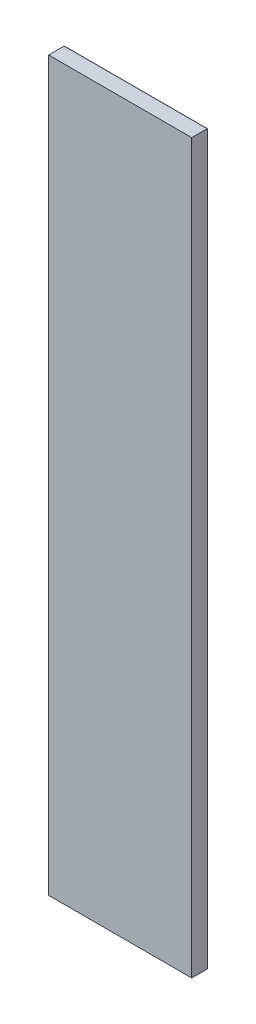
ISO-10303-21;
HEADER;
FILE_DESCRIPTION(('STEP AP214'),'2;1');
FILE_NAME('part.step','',(''),(''),'','','');
FILE_SCHEMA(('AUTOMOTIVE_DESIGN { 1 0 10303 214 1 1 1 1 }'));
ENDSEC;
DATA;
#1=APPLICATION_CONTEXT('core data for automotive mechanical design processes');
#2=APPLICATION_PROTOCOL_DEFINITION('international standard','automotive_design',2000,#1);
#3=PRODUCT_CONTEXT('',#1,'mechanical');
#4=PRODUCT('Part','Part','',(#3));
#5=PRODUCT_RELATED_PRODUCT_CATEGORY('part','',(#4));
#6=PRODUCT_DEFINITION_FORMATION('','',#4);
#7=PRODUCT_DEFINITION_CONTEXT('part definition',#1,'design');
#8=PRODUCT_DEFINITION('design','',#6,#7);
#9=PRODUCT_DEFINITION_SHAPE('','',#8);
#10=(LENGTH_UNIT() NAMED_UNIT(*) SI_UNIT(.MILLI.,.METRE.));
#11=(NAMED_UNIT(*) PLANE_ANGLE_UNIT() SI_UNIT($,.RADIAN.));
#12=(NAMED_UNIT(*) SI_UNIT($,.STERADIAN.) SOLID_ANGLE_UNIT());
#13=UNCERTAINTY_MEASURE_WITH_UNIT(LENGTH_MEASURE(1.E-05),#10,'distance_accuracy_value','');
#14=(GEOMETRIC_REPRESENTATION_CONTEXT(3) GLOBAL_UNCERTAINTY_ASSIGNED_CONTEXT((#13)) GLOBAL_UNIT_ASSIGNED_CONTEXT((#10,
#11,#12)) REPRESENTATION_CONTEXT('',''));
#15=CARTESIAN_POINT('',(0.,0.,0.));
#16=DIRECTION('',(0.,0.,1.));
#17=DIRECTION('',(1.,0.,0.));
#18=AXIS2_PLACEMENT_3D('',#15,#16,#17);
#19=CARTESIAN_POINT('',(-345.661387341554,720.,38.7691453664121));
#20=DIRECTION('',(1.,0.,0.));
#21=DIRECTION('',(0.,1.,0.));
#22=AXIS2_PLACEMENT_3D('',#19,#20,#21);
#23=CYLINDRICAL_SURFACE('',#22,3.50000000000004);
#24=CARTESIAN_POINT('',(351.5,720.,38.7691453664121));
#25=DIRECTION('',(1.,0.,0.));
#26=DIRECTION('',(0.,1.,0.));
#27=AXIS2_PLACEMENT_3D('',#24,#25,#26);
#28=CIRCLE('',#27,3.50000000000004);
#29=CARTESIAN_POINT('',(351.5,723.5,38.7691453664121));
#30=VERTEX_POINT('',#29);
#31=CARTESIAN_POINT('',(351.5,723.464101615138,38.2691453664121));
#32=VERTEX_POINT('',#31);
#33=EDGE_CURVE('E44',#30,#32,#28,.F.);
#34=ORIENTED_EDGE('',*,*,#33,.F.);
#35=DIRECTION('',(1.,0.,0.));
#36=VECTOR('',#35,1.);
#37=CARTESIAN_POINT('',(-345.661387341554,723.5,38.7691453664121));
#38=LINE('',#37,#36);
#39=CARTESIAN_POINT('',(488.500000000006,723.5,38.7691453664121));
#40=VERTEX_POINT('',#39);
#41=EDGE_CURVE('E127',#30,#40,#38,.T.);
#42=ORIENTED_EDGE('',*,*,#41,.T.);
#43=CARTESIAN_POINT('',(488.500000000006,720.,38.7691453664121));
#44=DIRECTION('',(-1.,0.,0.));
#45=DIRECTION('',(0.,0.,1.));
#46=AXIS2_PLACEMENT_3D('',#43,#44,#45);
#47=CIRCLE('',#46,3.50000000000004);
#48=CARTESIAN_POINT('',(488.500000000006,723.464101615138,38.2691453664121));
#49=VERTEX_POINT('',#48);
#50=EDGE_CURVE('E112',#40,#49,#47,.T.);
#51=ORIENTED_EDGE('',*,*,#50,.T.);
#52=DIRECTION('',(1.,0.,0.));
#53=VECTOR('',#52,1.);
#54=CARTESIAN_POINT('',(-345.661387341554,723.464101615138,38.2691453664121));
#55=LINE('',#54,#53);
#56=EDGE_CURVE('E92',#32,#49,#55,.T.);
#57=ORIENTED_EDGE('',*,*,#56,.F.);
#58=EDGE_LOOP('',(#34,#42,#51,#57));
#59=FACE_BOUND('',#58,.T.);
#60=ADVANCED_FACE('F36',(#59),#23,.T.);
#61=CARTESIAN_POINT('',(-345.661387341554,723.464101615138,38.2691453664121));
#62=DIRECTION('',(0.,0.,-1.));
#63=DIRECTION('',(-1.,0.,0.));
#64=AXIS2_PLACEMENT_3D('',#61,#62,#63);
#65=PLANE('',#64);
#66=DIRECTION('',(0.,-1.,0.));
#67=VECTOR('',#66,1.);
#68=CARTESIAN_POINT('',(351.5,723.464101615138,38.2691453664121));
#69=LINE('',#68,#67);
#70=CARTESIAN_POINT('',(351.5,26.5358983848625,38.2691453664121));
#71=VERTEX_POINT('',#70);
#72=EDGE_CURVE('E118',#32,#71,#69,.T.);
#73=ORIENTED_EDGE('',*,*,#72,.F.);
#74=ORIENTED_EDGE('',*,*,#56,.T.);
#75=DIRECTION('',(0.,-1.,0.));
#76=VECTOR('',#75,1.);
#77=CARTESIAN_POINT('',(488.500000000006,723.464101615138,38.2691453664121));
#78=LINE('',#77,#76);
#79=CARTESIAN_POINT('',(488.500000000006,26.5358983848625,38.2691453664121));
#80=VERTEX_POINT('',#79);
#81=EDGE_CURVE('E101',#49,#80,#78,.T.);
#82=ORIENTED_EDGE('',*,*,#81,.T.);
#83=DIRECTION('',(1.,0.,0.));
#84=VECTOR('',#83,1.);
#85=CARTESIAN_POINT('',(-345.661387341554,26.5358983848624,38.2691453664121));
#86=LINE('',#85,#84);
#87=EDGE_CURVE('E83',#71,#80,#86,.T.);
#88=ORIENTED_EDGE('',*,*,#87,.F.);
#89=EDGE_LOOP('',(#73,#74,#82,#88));
#90=FACE_BOUND('',#89,.T.);
#91=ADVANCED_FACE('F107',(#90),#65,.T.);
#92=CARTESIAN_POINT('',(-345.661387341554,30.0000000000001,38.7691453664121));
#93=DIRECTION('',(1.,0.,0.));
#94=DIRECTION('',(0.,1.,0.));
#95=AXIS2_PLACEMENT_3D('',#92,#93,#94);
#96=CYLINDRICAL_SURFACE('',#95,3.5);
#97=CARTESIAN_POINT('',(351.5,30.0000000000002,38.7691453664121));
#98=DIRECTION('',(1.,0.,0.));
#99=DIRECTION('',(0.,1.,0.));
#100=AXIS2_PLACEMENT_3D('',#97,#98,#99);
#101=CIRCLE('',#100,3.5);
#102=CARTESIAN_POINT('',(351.5,26.5000000000002,38.7691453664121));
#103=VERTEX_POINT('',#102);
#104=EDGE_CURVE('E88',#71,#103,#101,.F.);
#105=ORIENTED_EDGE('',*,*,#104,.F.);
#106=ORIENTED_EDGE('',*,*,#87,.T.);
#107=CARTESIAN_POINT('',(488.500000000006,30.0000000000002,38.7691453664121));
#108=DIRECTION('',(-1.,0.,0.));
#109=DIRECTION('',(0.,0.,1.));
#110=AXIS2_PLACEMENT_3D('',#107,#108,#109);
#111=CIRCLE('',#110,3.5);
#112=CARTESIAN_POINT('',(488.500000000006,26.5000000000002,38.7691453664121));
#113=VERTEX_POINT('',#112);
#114=EDGE_CURVE('E87',#80,#113,#111,.T.);
#115=ORIENTED_EDGE('',*,*,#114,.T.);
#116=DIRECTION('',(1.,0.,0.));
#117=VECTOR('',#116,1.);
#118=CARTESIAN_POINT('',(-345.661387341554,26.5000000000001,38.7691453664121));
#119=LINE('',#118,#117);
#120=EDGE_CURVE('E93',#103,#113,#119,.T.);
#121=ORIENTED_EDGE('',*,*,#120,.F.);
#122=EDGE_LOOP('',(#105,#106,#115,#121));
#123=FACE_BOUND('',#122,.T.);
#124=ADVANCED_FACE('F85',(#123),#96,.T.);
#125=CARTESIAN_POINT('',(-345.661387341554,26.5000000000001,38.7691453664121));
#126=DIRECTION('',(0.,-1.,0.));
#127=DIRECTION('',(0.,0.,-1.));
#128=AXIS2_PLACEMENT_3D('',#125,#126,#127);
#129=PLANE('',#128);
#130=DIRECTION('',(0.,0.,1.));
#131=VECTOR('',#130,1.);
#132=CARTESIAN_POINT('',(351.5,26.5000000000002,38.7691453664121));
#133=LINE('',#132,#131);
#134=CARTESIAN_POINT('',(351.5,26.5000000000002,53.269145366412));
#135=VERTEX_POINT('',#134);
#136=EDGE_CURVE('E51',#103,#135,#133,.T.);
#137=ORIENTED_EDGE('',*,*,#136,.F.);
#138=ORIENTED_EDGE('',*,*,#120,.T.);
#139=DIRECTION('',(0.,0.,1.));
#140=VECTOR('',#139,1.);
#141=CARTESIAN_POINT('',(488.500000000006,26.5000000000002,38.7691453664121));
#142=LINE('',#141,#140);
#143=CARTESIAN_POINT('',(488.500000000006,26.5000000000002,53.269145366412));
#144=VERTEX_POINT('',#143);
#145=EDGE_CURVE('E105',#113,#144,#142,.T.);
#146=ORIENTED_EDGE('',*,*,#145,.T.);
#147=DIRECTION('',(1.,0.,0.));
#148=VECTOR('',#147,1.);
#149=CARTESIAN_POINT('',(-345.661387341554,26.5000000000002,53.269145366412));
#150=LINE('',#149,#148);
#151=EDGE_CURVE('E124',#135,#144,#150,.T.);
#152=ORIENTED_EDGE('',*,*,#151,.F.);
#153=EDGE_LOOP('',(#137,#138,#146,#152));
#154=FACE_BOUND('',#153,.T.);
#155=ADVANCED_FACE('F140',(#154),#129,.T.);
#156=CARTESIAN_POINT('',(-345.661387341554,723.5,53.2691453664121));
#157=DIRECTION('',(0.,0.,1.));
#158=DIRECTION('',(0.,-1.,0.));
#159=AXIS2_PLACEMENT_3D('',#156,#157,#158);
#160=PLANE('',#159);
#161=DIRECTION('',(0.,1.,0.));
#162=VECTOR('',#161,1.);
#163=CARTESIAN_POINT('',(351.5,723.5,53.2691453664121));
#164=LINE('',#163,#162);
#165=CARTESIAN_POINT('',(351.5,723.5,53.2691453664121));
#166=VERTEX_POINT('',#165);
#167=EDGE_CURVE('E114',#135,#166,#164,.T.);
#168=ORIENTED_EDGE('',*,*,#167,.F.);
#169=ORIENTED_EDGE('',*,*,#151,.T.);
#170=DIRECTION('',(0.,1.,0.));
#171=VECTOR('',#170,1.);
#172=CARTESIAN_POINT('',(488.500000000006,723.5,53.2691453664121));
#173=LINE('',#172,#171);
#174=CARTESIAN_POINT('',(488.500000000006,723.5,53.2691453664121));
#175=VERTEX_POINT('',#174);
#176=EDGE_CURVE('E133',#144,#175,#173,.T.);
#177=ORIENTED_EDGE('',*,*,#176,.T.);
#178=DIRECTION('',(1.,0.,0.));
#179=VECTOR('',#178,1.);
#180=CARTESIAN_POINT('',(-345.661387341554,723.5,53.2691453664121));
#181=LINE('',#180,#179);
#182=EDGE_CURVE('E126',#166,#175,#181,.T.);
#183=ORIENTED_EDGE('',*,*,#182,.F.);
#184=EDGE_LOOP('',(#168,#169,#177,#183));
#185=FACE_BOUND('',#184,.T.);
#186=ADVANCED_FACE('F142',(#185),#160,.T.);
#187=CARTESIAN_POINT('',(-345.661387341554,723.5,53.2691453664121));
#188=DIRECTION('',(0.,1.,0.));
#189=DIRECTION('',(-1.,0.,0.));
#190=AXIS2_PLACEMENT_3D('',#187,#188,#189);
#191=PLANE('',#190);
#192=DIRECTION('',(0.,0.,-1.));
#193=VECTOR('',#192,1.);
#194=CARTESIAN_POINT('',(351.5,723.5,53.2691453664121));
#195=LINE('',#194,#193);
#196=EDGE_CURVE('E11',#166,#30,#195,.T.);
#197=ORIENTED_EDGE('',*,*,#196,.F.);
#198=ORIENTED_EDGE('',*,*,#182,.T.);
#199=DIRECTION('',(0.,0.,-1.));
#200=VECTOR('',#199,1.);
#201=CARTESIAN_POINT('',(488.500000000006,723.5,53.2691453664121));
#202=LINE('',#201,#200);
#203=EDGE_CURVE('E131',#175,#40,#202,.T.);
#204=ORIENTED_EDGE('',*,*,#203,.T.);
#205=ORIENTED_EDGE('',*,*,#41,.F.);
#206=EDGE_LOOP('',(#197,#198,#204,#205));
#207=FACE_BOUND('',#206,.T.);
#208=ADVANCED_FACE('F146',(#207),#191,.T.);
#209=CARTESIAN_POINT('',(351.5,725.,63.7691453664121));
#210=DIRECTION('',(1.,0.,0.));
#211=DIRECTION('',(0.,1.,0.));
#212=AXIS2_PLACEMENT_3D('',#209,#210,#211);
#213=PLANE('',#212);
#214=ORIENTED_EDGE('',*,*,#33,.T.);
#215=ORIENTED_EDGE('',*,*,#72,.T.);
#216=ORIENTED_EDGE('',*,*,#104,.T.);
#217=ORIENTED_EDGE('',*,*,#136,.T.);
#218=ORIENTED_EDGE('',*,*,#167,.T.);
#219=ORIENTED_EDGE('',*,*,#196,.T.);
#220=EDGE_LOOP('',(#214,#215,#216,#217,#218,#219));
#221=FACE_BOUND('',#220,.T.);
#222=ADVANCED_FACE('F145',(#221),#213,.F.);
#223=CARTESIAN_POINT('',(488.500000000006,725.,63.7691453664121));
#224=DIRECTION('',(-1.,0.,0.));
#225=DIRECTION('',(0.,0.,1.));
#226=AXIS2_PLACEMENT_3D('',#223,#224,#225);
#227=PLANE('',#226);
#228=ORIENTED_EDGE('',*,*,#203,.F.);
#229=ORIENTED_EDGE('',*,*,#176,.F.);
#230=ORIENTED_EDGE('',*,*,#145,.F.);
#231=ORIENTED_EDGE('',*,*,#114,.F.);
#232=ORIENTED_EDGE('',*,*,#81,.F.);
#233=ORIENTED_EDGE('',*,*,#50,.F.);
#234=EDGE_LOOP('',(#228,#229,#230,#231,#232,#233));
#235=FACE_BOUND('',#234,.T.);
#236=ADVANCED_FACE('F99',(#235),#227,.F.);
#237=CLOSED_SHELL('',(#60,#91,#124,#155,#186,#208,#222,#236));
#238=MANIFOLD_SOLID_BREP('B2',#237);
#239=ADVANCED_BREP_SHAPE_REPRESENTATION('',(#18,#238),#14);
#240=SHAPE_DEFINITION_REPRESENTATION(#9,#239);
ENDSEC;
END-ISO-10303-21;
